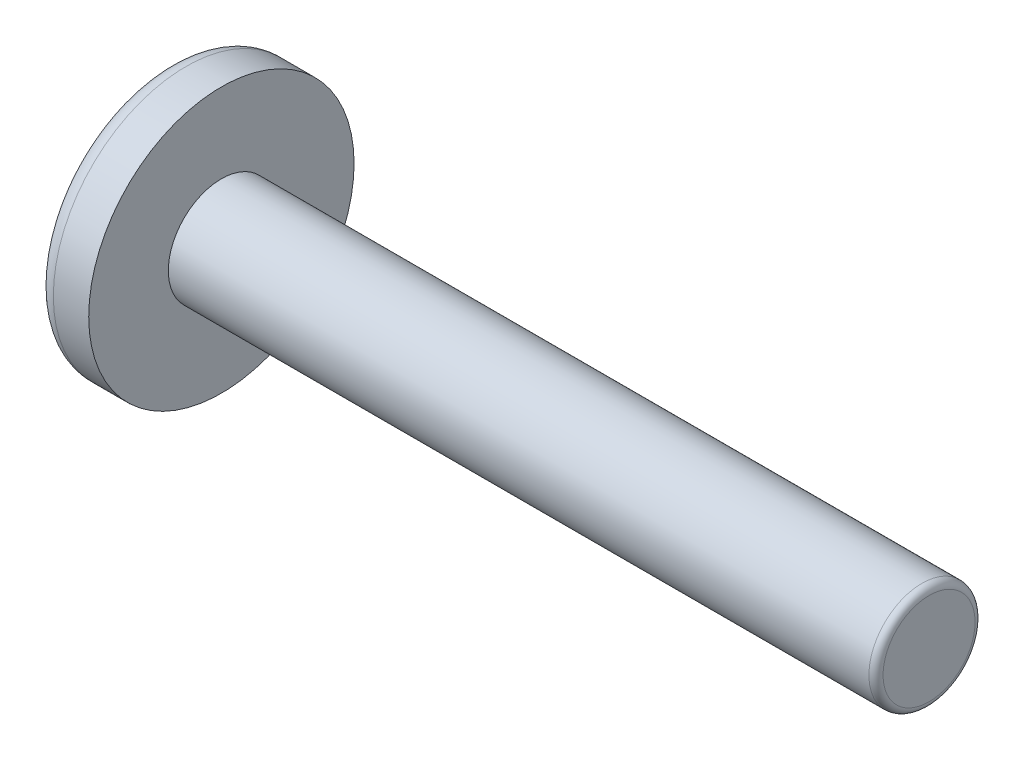
ISO-10303-21;
HEADER;
FILE_DESCRIPTION(('STEP AP214'),'2;1');
FILE_NAME('part.step','',(''),(''),'','','');
FILE_SCHEMA(('AUTOMOTIVE_DESIGN { 1 0 10303 214 1 1 1 1 }'));
ENDSEC;
DATA;
#1=APPLICATION_CONTEXT('core data for automotive mechanical design processes');
#2=APPLICATION_PROTOCOL_DEFINITION('international standard','automotive_design',2000,#1);
#3=PRODUCT_CONTEXT('',#1,'mechanical');
#4=PRODUCT('Part','Part','',(#3));
#5=PRODUCT_RELATED_PRODUCT_CATEGORY('part','',(#4));
#6=PRODUCT_DEFINITION_FORMATION('','',#4);
#7=PRODUCT_DEFINITION_CONTEXT('part definition',#1,'design');
#8=PRODUCT_DEFINITION('design','',#6,#7);
#9=PRODUCT_DEFINITION_SHAPE('','',#8);
#10=(LENGTH_UNIT() NAMED_UNIT(*) SI_UNIT(.MILLI.,.METRE.));
#11=(NAMED_UNIT(*) PLANE_ANGLE_UNIT() SI_UNIT($,.RADIAN.));
#12=(NAMED_UNIT(*) SI_UNIT($,.STERADIAN.) SOLID_ANGLE_UNIT());
#13=UNCERTAINTY_MEASURE_WITH_UNIT(LENGTH_MEASURE(1.E-05),#10,'distance_accuracy_value','');
#14=(GEOMETRIC_REPRESENTATION_CONTEXT(3) GLOBAL_UNCERTAINTY_ASSIGNED_CONTEXT((#13)) GLOBAL_UNIT_ASSIGNED_CONTEXT((#10,
#11,#12)) REPRESENTATION_CONTEXT('',''));
#15=CARTESIAN_POINT('',(0.,0.,0.));
#16=DIRECTION('',(0.,0.,1.));
#17=DIRECTION('',(1.,0.,0.));
#18=AXIS2_PLACEMENT_3D('',#15,#16,#17);
#19=CARTESIAN_POINT('',(20.,0.,0.));
#20=DIRECTION('',(-1.,0.,0.));
#21=DIRECTION('',(0.,0.,1.));
#22=AXIS2_PLACEMENT_3D('',#19,#20,#21);
#23=CYLINDRICAL_SURFACE('',#22,1.5);
#24=CARTESIAN_POINT('',(19.8,0.,0.));
#25=DIRECTION('',(1.,0.,0.));
#26=DIRECTION('',(0.,0.,-1.));
#27=AXIS2_PLACEMENT_3D('',#24,#25,#26);
#28=CIRCLE('',#27,1.5);
#29=CARTESIAN_POINT('',(19.8,0.,-1.5));
#30=VERTEX_POINT('',#29);
#31=EDGE_CURVE('E10',#30,#30,#28,.F.);
#32=ORIENTED_EDGE('',*,*,#31,.T.);
#33=EDGE_LOOP('',(#32));
#34=FACE_BOUND('',#33,.T.);
#35=CARTESIAN_POINT('',(0.,0.,0.));
#36=DIRECTION('',(1.,0.,0.));
#37=DIRECTION('',(0.,0.,-1.));
#38=AXIS2_PLACEMENT_3D('',#35,#36,#37);
#39=CIRCLE('',#38,1.5);
#40=CARTESIAN_POINT('',(0.,0.,-1.5));
#41=VERTEX_POINT('',#40);
#42=EDGE_CURVE('E61',#41,#41,#39,.T.);
#43=ORIENTED_EDGE('',*,*,#42,.T.);
#44=EDGE_LOOP('',(#43));
#45=FACE_BOUND('',#44,.T.);
#46=ADVANCED_FACE('F37',(#34,#45),#23,.T.);
#47=CARTESIAN_POINT('',(20.,0.,0.));
#48=DIRECTION('',(1.,0.,0.));
#49=DIRECTION('',(0.,0.,-1.));
#50=AXIS2_PLACEMENT_3D('',#47,#48,#49);
#51=PLANE('',#50);
#52=CARTESIAN_POINT('',(20.,0.,0.));
#53=DIRECTION('',(1.,0.,0.));
#54=DIRECTION('',(0.,0.,-1.));
#55=AXIS2_PLACEMENT_3D('',#52,#53,#54);
#56=CIRCLE('',#55,1.3);
#57=CARTESIAN_POINT('',(20.,0.,-1.3));
#58=VERTEX_POINT('',#57);
#59=EDGE_CURVE('E45',#58,#58,#56,.T.);
#60=ORIENTED_EDGE('',*,*,#59,.T.);
#61=EDGE_LOOP('',(#60));
#62=FACE_BOUND('',#61,.T.);
#63=ADVANCED_FACE('F88',(#62),#51,.T.);
#64=CARTESIAN_POINT('',(-1.5,0.,0.));
#65=DIRECTION('',(1.,0.,0.));
#66=DIRECTION('',(0.,0.,-1.));
#67=AXIS2_PLACEMENT_3D('',#64,#65,#66);
#68=CYLINDRICAL_SURFACE('',#67,3.75);
#69=CARTESIAN_POINT('',(-1.,0.,0.));
#70=DIRECTION('',(-1.,0.,0.));
#71=DIRECTION('',(0.,0.,1.));
#72=AXIS2_PLACEMENT_3D('',#69,#70,#71);
#73=CIRCLE('',#72,3.75);
#74=CARTESIAN_POINT('',(-1.,0.,3.75));
#75=VERTEX_POINT('',#74);
#76=EDGE_CURVE('E50',#75,#75,#73,.F.);
#77=ORIENTED_EDGE('',*,*,#76,.T.);
#78=EDGE_LOOP('',(#77));
#79=FACE_BOUND('',#78,.T.);
#80=CARTESIAN_POINT('',(0.,0.,0.));
#81=DIRECTION('',(-1.,0.,0.));
#82=DIRECTION('',(0.,0.,1.));
#83=AXIS2_PLACEMENT_3D('',#80,#81,#82);
#84=CIRCLE('',#83,3.75);
#85=CARTESIAN_POINT('',(0.,0.,3.75));
#86=VERTEX_POINT('',#85);
#87=EDGE_CURVE('E65',#86,#86,#84,.T.);
#88=ORIENTED_EDGE('',*,*,#87,.T.);
#89=EDGE_LOOP('',(#88));
#90=FACE_BOUND('',#89,.T.);
#91=ADVANCED_FACE('F70',(#79,#90),#68,.T.);
#92=CARTESIAN_POINT('',(-1.5,0.,0.));
#93=DIRECTION('',(-1.,0.,0.));
#94=DIRECTION('',(0.,0.,1.));
#95=AXIS2_PLACEMENT_3D('',#92,#93,#94);
#96=PLANE('',#95);
#97=CARTESIAN_POINT('',(-1.5,0.,0.));
#98=DIRECTION('',(-1.,0.,0.));
#99=DIRECTION('',(0.,0.,1.));
#100=AXIS2_PLACEMENT_3D('',#97,#98,#99);
#101=CIRCLE('',#100,3.25);
#102=CARTESIAN_POINT('',(-1.5,0.,3.25));
#103=VERTEX_POINT('',#102);
#104=EDGE_CURVE('E55',#103,#103,#101,.T.);
#105=ORIENTED_EDGE('',*,*,#104,.T.);
#106=EDGE_LOOP('',(#105));
#107=FACE_BOUND('',#106,.T.);
#108=ADVANCED_FACE('F75',(#107),#96,.T.);
#109=CARTESIAN_POINT('',(0.,0.,0.));
#110=DIRECTION('',(-1.,0.,0.));
#111=DIRECTION('',(0.,0.,1.));
#112=AXIS2_PLACEMENT_3D('',#109,#110,#111);
#113=PLANE('',#112);
#114=ORIENTED_EDGE('',*,*,#42,.F.);
#115=EDGE_LOOP('',(#114));
#116=FACE_BOUND('',#115,.T.);
#117=ORIENTED_EDGE('',*,*,#87,.F.);
#118=EDGE_LOOP('',(#117));
#119=FACE_BOUND('',#118,.T.);
#120=ADVANCED_FACE('F72',(#116,#119),#113,.F.);
#121=CARTESIAN_POINT('',(-1.,0.,0.));
#122=DIRECTION('',(-1.,0.,0.));
#123=DIRECTION('',(0.,0.,1.));
#124=AXIS2_PLACEMENT_3D('',#121,#122,#123);
#125=TOROIDAL_SURFACE('',#124,3.25,0.5);
#126=ORIENTED_EDGE('',*,*,#76,.F.);
#127=EDGE_LOOP('',(#126));
#128=FACE_BOUND('',#127,.T.);
#129=ORIENTED_EDGE('',*,*,#104,.F.);
#130=EDGE_LOOP('',(#129));
#131=FACE_BOUND('',#130,.T.);
#132=ADVANCED_FACE('F74',(#128,#131),#125,.T.);
#133=CARTESIAN_POINT('',(19.8,0.,0.));
#134=DIRECTION('',(1.,0.,0.));
#135=DIRECTION('',(0.,0.,-1.));
#136=AXIS2_PLACEMENT_3D('',#133,#134,#135);
#137=TOROIDAL_SURFACE('',#136,1.3,0.2);
#138=ORIENTED_EDGE('',*,*,#31,.F.);
#139=EDGE_LOOP('',(#138));
#140=FACE_BOUND('',#139,.T.);
#141=ORIENTED_EDGE('',*,*,#59,.F.);
#142=EDGE_LOOP('',(#141));
#143=FACE_BOUND('',#142,.T.);
#144=ADVANCED_FACE('F39',(#140,#143),#137,.T.);
#145=CLOSED_SHELL('',(#46,#63,#91,#108,#120,#132,#144));
#146=MANIFOLD_SOLID_BREP('B2',#145);
#147=ADVANCED_BREP_SHAPE_REPRESENTATION('',(#18,#146),#14);
#148=SHAPE_DEFINITION_REPRESENTATION(#9,#147);
ENDSEC;
END-ISO-10303-21;
